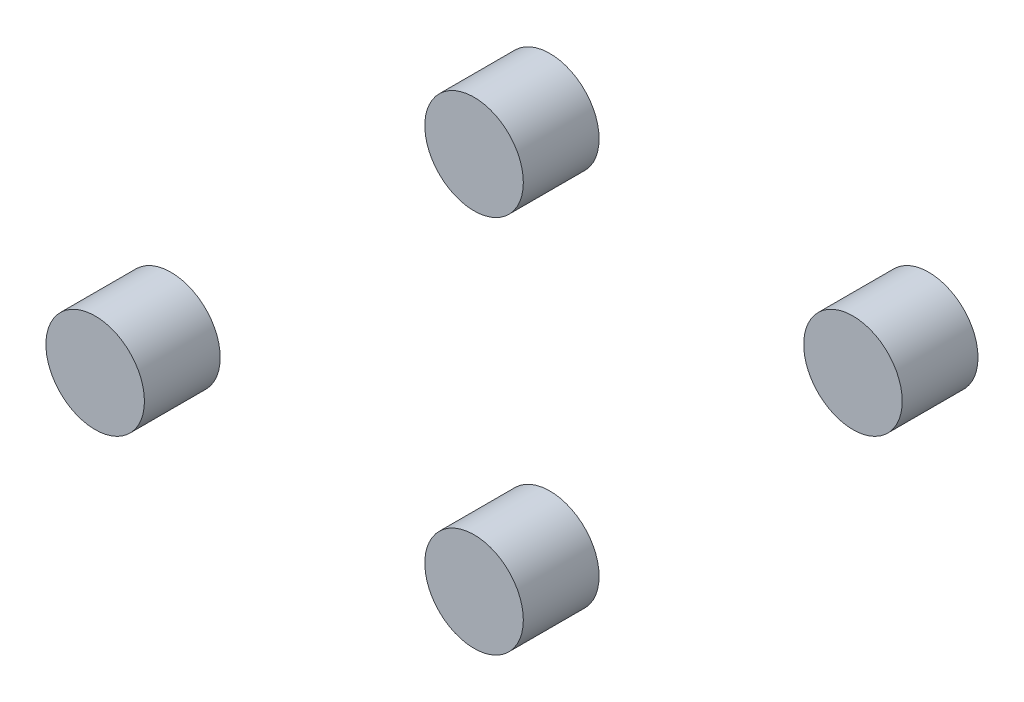
ISO-10303-21;
HEADER;
FILE_DESCRIPTION(('STEP AP214'),'2;1');
FILE_NAME('part.step','',(''),(''),'','','');
FILE_SCHEMA(('AUTOMOTIVE_DESIGN { 1 0 10303 214 1 1 1 1 }'));
ENDSEC;
DATA;
#1=APPLICATION_CONTEXT('core data for automotive mechanical design processes');
#2=APPLICATION_PROTOCOL_DEFINITION('international standard','automotive_design',2000,#1);
#3=PRODUCT_CONTEXT('',#1,'mechanical');
#4=PRODUCT('Part','Part','',(#3));
#5=PRODUCT_RELATED_PRODUCT_CATEGORY('part','',(#4));
#6=PRODUCT_DEFINITION_FORMATION('','',#4);
#7=PRODUCT_DEFINITION_CONTEXT('part definition',#1,'design');
#8=PRODUCT_DEFINITION('design','',#6,#7);
#9=PRODUCT_DEFINITION_SHAPE('','',#8);
#10=(LENGTH_UNIT() NAMED_UNIT(*) SI_UNIT(.MILLI.,.METRE.));
#11=(NAMED_UNIT(*) PLANE_ANGLE_UNIT() SI_UNIT($,.RADIAN.));
#12=(NAMED_UNIT(*) SI_UNIT($,.STERADIAN.) SOLID_ANGLE_UNIT());
#13=UNCERTAINTY_MEASURE_WITH_UNIT(LENGTH_MEASURE(1.E-05),#10,'distance_accuracy_value','');
#14=(GEOMETRIC_REPRESENTATION_CONTEXT(3) GLOBAL_UNCERTAINTY_ASSIGNED_CONTEXT((#13)) GLOBAL_UNIT_ASSIGNED_CONTEXT((#10,
#11,#12)) REPRESENTATION_CONTEXT('',''));
#15=CARTESIAN_POINT('',(0.,0.,0.));
#16=DIRECTION('',(0.,0.,1.));
#17=DIRECTION('',(1.,0.,0.));
#18=AXIS2_PLACEMENT_3D('',#15,#16,#17);
#19=CARTESIAN_POINT('',(381.,0.,-152.4));
#20=DIRECTION('',(0.,0.,-1.));
#21=DIRECTION('',(1.,0.,0.));
#22=AXIS2_PLACEMENT_3D('',#19,#20,#21);
#23=CYLINDRICAL_SURFACE('',#22,49.5300000000001);
#24=CARTESIAN_POINT('',(381.,0.,-152.4));
#25=DIRECTION('',(0.,0.,1.));
#26=DIRECTION('',(1.,0.,0.));
#27=AXIS2_PLACEMENT_3D('',#24,#25,#26);
#28=CIRCLE('',#27,49.5300000000001);
#29=CARTESIAN_POINT('',(430.53,0.,-152.4));
#30=VERTEX_POINT('',#29);
#31=EDGE_CURVE('E50',#30,#30,#28,.T.);
#32=CARTESIAN_POINT('',(381.,0.,-228.6));
#33=DIRECTION('',(0.,0.,1.));
#34=DIRECTION('',(1.,0.,0.));
#35=AXIS2_PLACEMENT_3D('',#32,#33,#34);
#36=CIRCLE('',#35,49.5300000000001);
#37=CARTESIAN_POINT('',(430.53,0.,-228.6));
#38=VERTEX_POINT('',#37);
#39=EDGE_CURVE('E11',#38,#38,#36,.T.);
#40=CARTESIAN_POINT('',(430.53,0.,-152.4));
#41=CARTESIAN_POINT('',(430.53,0.,-153.19375));
#42=CARTESIAN_POINT('',(430.53,0.,-153.9875));
#43=CARTESIAN_POINT('',(430.53,0.,-155.575));
#44=CARTESIAN_POINT('',(430.53,0.,-156.36875));
#45=CARTESIAN_POINT('',(430.53,0.,-157.95625));
#46=CARTESIAN_POINT('',(430.53,0.,-158.75));
#47=CARTESIAN_POINT('',(430.53,0.,-160.3375));
#48=CARTESIAN_POINT('',(430.53,0.,-161.13125));
#49=CARTESIAN_POINT('',(430.53,0.,-162.71875));
#50=CARTESIAN_POINT('',(430.53,0.,-163.5125));
#51=CARTESIAN_POINT('',(430.53,0.,-165.1));
#52=CARTESIAN_POINT('',(430.53,0.,-165.89375));
#53=CARTESIAN_POINT('',(430.53,0.,-167.48125));
#54=CARTESIAN_POINT('',(430.53,0.,-168.275));
#55=CARTESIAN_POINT('',(430.53,0.,-169.8625));
#56=CARTESIAN_POINT('',(430.53,0.,-170.65625));
#57=CARTESIAN_POINT('',(430.53,0.,-172.24375));
#58=CARTESIAN_POINT('',(430.53,0.,-173.0375));
#59=CARTESIAN_POINT('',(430.53,0.,-174.625));
#60=CARTESIAN_POINT('',(430.53,0.,-175.41875));
#61=CARTESIAN_POINT('',(430.53,0.,-177.00625));
#62=CARTESIAN_POINT('',(430.53,0.,-177.8));
#63=CARTESIAN_POINT('',(430.53,0.,-179.3875));
#64=CARTESIAN_POINT('',(430.53,0.,-180.18125));
#65=CARTESIAN_POINT('',(430.53,0.,-181.76875));
#66=CARTESIAN_POINT('',(430.53,0.,-182.5625));
#67=CARTESIAN_POINT('',(430.53,0.,-184.15));
#68=CARTESIAN_POINT('',(430.53,0.,-184.94375));
#69=CARTESIAN_POINT('',(430.53,0.,-186.53125));
#70=CARTESIAN_POINT('',(430.53,0.,-187.325));
#71=CARTESIAN_POINT('',(430.53,0.,-188.9125));
#72=CARTESIAN_POINT('',(430.53,0.,-189.70625));
#73=CARTESIAN_POINT('',(430.53,0.,-191.29375));
#74=CARTESIAN_POINT('',(430.53,0.,-192.0875));
#75=CARTESIAN_POINT('',(430.53,0.,-193.675));
#76=CARTESIAN_POINT('',(430.53,0.,-194.46875));
#77=CARTESIAN_POINT('',(430.53,0.,-196.05625));
#78=CARTESIAN_POINT('',(430.53,0.,-196.85));
#79=CARTESIAN_POINT('',(430.53,0.,-198.4375));
#80=CARTESIAN_POINT('',(430.53,0.,-199.23125));
#81=CARTESIAN_POINT('',(430.53,0.,-200.81875));
#82=CARTESIAN_POINT('',(430.53,0.,-201.6125));
#83=CARTESIAN_POINT('',(430.53,0.,-203.2));
#84=CARTESIAN_POINT('',(430.53,0.,-203.99375));
#85=CARTESIAN_POINT('',(430.53,0.,-205.58125));
#86=CARTESIAN_POINT('',(430.53,0.,-206.375));
#87=CARTESIAN_POINT('',(430.53,0.,-207.9625));
#88=CARTESIAN_POINT('',(430.53,0.,-208.75625));
#89=CARTESIAN_POINT('',(430.53,0.,-210.34375));
#90=CARTESIAN_POINT('',(430.53,0.,-211.1375));
#91=CARTESIAN_POINT('',(430.53,0.,-212.725));
#92=CARTESIAN_POINT('',(430.53,0.,-213.51875));
#93=CARTESIAN_POINT('',(430.53,0.,-215.10625));
#94=CARTESIAN_POINT('',(430.53,0.,-215.9));
#95=CARTESIAN_POINT('',(430.53,0.,-217.4875));
#96=CARTESIAN_POINT('',(430.53,0.,-218.28125));
#97=CARTESIAN_POINT('',(430.53,0.,-219.86875));
#98=CARTESIAN_POINT('',(430.53,0.,-220.6625));
#99=CARTESIAN_POINT('',(430.53,0.,-222.25));
#100=CARTESIAN_POINT('',(430.53,0.,-223.04375));
#101=CARTESIAN_POINT('',(430.53,0.,-224.63125));
#102=CARTESIAN_POINT('',(430.53,0.,-225.425));
#103=CARTESIAN_POINT('',(430.53,0.,-227.0125));
#104=CARTESIAN_POINT('',(430.53,0.,-227.80625));
#105=CARTESIAN_POINT('',(430.53,0.,-228.6));
#106=B_SPLINE_CURVE_WITH_KNOTS('',3,(#40,#41,#42,#43,#44,#45,#46,#47,#48,#49,#50,#51,#52,#53,
#54,#55,#56,#57,#58,#59,#60,#61,#62,#63,#64,#65,#66,#67,#68,#69,#70,#71,#72,#73,#74,#75,#76,#77,
#78,#79,#80,#81,#82,#83,#84,#85,#86,#87,#88,#89,#90,#91,#92,#93,#94,#95,#96,#97,#98,#99,#100,
#101,#102,#103,#104,#105),.UNSPECIFIED.,.F.,.F.,(4,2,2,2,2,2,2,2,2,2,2,2,2,2,2,2,2,2,2,2,2,2,2,
2,2,2,2,2,2,2,2,2,4),(0.,2.38124999999997,4.76249999999998,7.14374999999998,9.52499999999998,
11.90625,14.2875,16.66875,19.05,21.43125,23.8125,26.19375,28.575,30.95625,33.3375,35.71875,38.1,
40.48125,42.8625,45.24375,47.625,50.00625,52.3875,54.76875,57.15,59.53125,61.9125,64.29375,
66.675,69.05625,71.4375,73.81875,76.2),.UNSPECIFIED.);
#107=EDGE_CURVE('BSEAM46',#30,#38,#106,.T.);
#108=ORIENTED_EDGE('',*,*,#31,.F.);
#109=ORIENTED_EDGE('',*,*,#39,.T.);
#110=ORIENTED_EDGE('',*,*,#107,.T.);
#111=ORIENTED_EDGE('',*,*,#107,.F.);
#112=EDGE_LOOP('',(#108,#110,#109,#111));
#113=FACE_BOUND('',#112,.T.);
#114=ADVANCED_FACE('F46',(#113),#23,.T.);
#115=CARTESIAN_POINT('',(381.,0.,-152.4));
#116=DIRECTION('',(0.,0.,-1.));
#117=DIRECTION('',(1.,0.,0.));
#118=AXIS2_PLACEMENT_3D('',#115,#116,#117);
#119=PLANE('',#118);
#120=ORIENTED_EDGE('',*,*,#31,.T.);
#121=EDGE_LOOP('',(#120));
#122=FACE_BOUND('',#121,.T.);
#123=ADVANCED_FACE('F48',(#122),#119,.F.);
#124=CARTESIAN_POINT('',(381.,0.,-228.6));
#125=DIRECTION('',(0.,0.,-1.));
#126=DIRECTION('',(1.,0.,0.));
#127=AXIS2_PLACEMENT_3D('',#124,#125,#126);
#128=PLANE('',#127);
#129=ORIENTED_EDGE('',*,*,#39,.F.);
#130=EDGE_LOOP('',(#129));
#131=FACE_BOUND('',#130,.T.);
#132=ADVANCED_FACE('F65',(#131),#128,.T.);
#133=CLOSED_SHELL('',(#114,#123,#132));
#134=MANIFOLD_SOLID_BREP('B2',#133);
#135=CARTESIAN_POINT('',(0.,0.,-152.4));
#136=DIRECTION('',(0.,0.,-1.));
#137=DIRECTION('',(1.,0.,0.));
#138=AXIS2_PLACEMENT_3D('',#135,#136,#137);
#139=CYLINDRICAL_SURFACE('',#138,49.53);
#140=CARTESIAN_POINT('',(0.,0.,-152.4));
#141=DIRECTION('',(0.,0.,1.));
#142=DIRECTION('',(1.,0.,0.));
#143=AXIS2_PLACEMENT_3D('',#140,#141,#142);
#144=CIRCLE('',#143,49.53);
#145=CARTESIAN_POINT('',(49.53,0.,-152.4));
#146=VERTEX_POINT('',#145);
#147=EDGE_CURVE('E45',#146,#146,#144,.T.);
#148=CARTESIAN_POINT('',(0.,0.,-228.6));
#149=DIRECTION('',(0.,0.,1.));
#150=DIRECTION('',(1.,0.,0.));
#151=AXIS2_PLACEMENT_3D('',#148,#149,#150);
#152=CIRCLE('',#151,49.53);
#153=CARTESIAN_POINT('',(49.53,0.,-228.6));
#154=VERTEX_POINT('',#153);
#155=EDGE_CURVE('E98',#154,#154,#152,.T.);
#156=CARTESIAN_POINT('',(49.53,0.,-152.4));
#157=CARTESIAN_POINT('',(49.53,0.,-153.19375));
#158=CARTESIAN_POINT('',(49.53,0.,-153.9875));
#159=CARTESIAN_POINT('',(49.53,0.,-155.575));
#160=CARTESIAN_POINT('',(49.53,0.,-156.36875));
#161=CARTESIAN_POINT('',(49.53,0.,-157.95625));
#162=CARTESIAN_POINT('',(49.53,0.,-158.75));
#163=CARTESIAN_POINT('',(49.53,0.,-160.3375));
#164=CARTESIAN_POINT('',(49.53,0.,-161.13125));
#165=CARTESIAN_POINT('',(49.53,0.,-162.71875));
#166=CARTESIAN_POINT('',(49.53,0.,-163.5125));
#167=CARTESIAN_POINT('',(49.53,0.,-165.1));
#168=CARTESIAN_POINT('',(49.53,0.,-165.89375));
#169=CARTESIAN_POINT('',(49.53,0.,-167.48125));
#170=CARTESIAN_POINT('',(49.53,0.,-168.275));
#171=CARTESIAN_POINT('',(49.53,0.,-169.8625));
#172=CARTESIAN_POINT('',(49.53,0.,-170.65625));
#173=CARTESIAN_POINT('',(49.53,0.,-172.24375));
#174=CARTESIAN_POINT('',(49.53,0.,-173.0375));
#175=CARTESIAN_POINT('',(49.53,0.,-174.625));
#176=CARTESIAN_POINT('',(49.53,0.,-175.41875));
#177=CARTESIAN_POINT('',(49.53,0.,-177.00625));
#178=CARTESIAN_POINT('',(49.53,0.,-177.8));
#179=CARTESIAN_POINT('',(49.53,0.,-179.3875));
#180=CARTESIAN_POINT('',(49.53,0.,-180.18125));
#181=CARTESIAN_POINT('',(49.53,0.,-181.76875));
#182=CARTESIAN_POINT('',(49.53,0.,-182.5625));
#183=CARTESIAN_POINT('',(49.53,0.,-184.15));
#184=CARTESIAN_POINT('',(49.53,0.,-184.94375));
#185=CARTESIAN_POINT('',(49.53,0.,-186.53125));
#186=CARTESIAN_POINT('',(49.53,0.,-187.325));
#187=CARTESIAN_POINT('',(49.53,0.,-188.9125));
#188=CARTESIAN_POINT('',(49.53,0.,-189.70625));
#189=CARTESIAN_POINT('',(49.53,0.,-191.29375));
#190=CARTESIAN_POINT('',(49.53,0.,-192.0875));
#191=CARTESIAN_POINT('',(49.53,0.,-193.675));
#192=CARTESIAN_POINT('',(49.53,0.,-194.46875));
#193=CARTESIAN_POINT('',(49.53,0.,-196.05625));
#194=CARTESIAN_POINT('',(49.53,0.,-196.85));
#195=CARTESIAN_POINT('',(49.53,0.,-198.4375));
#196=CARTESIAN_POINT('',(49.53,0.,-199.23125));
#197=CARTESIAN_POINT('',(49.53,0.,-200.81875));
#198=CARTESIAN_POINT('',(49.53,0.,-201.6125));
#199=CARTESIAN_POINT('',(49.53,0.,-203.2));
#200=CARTESIAN_POINT('',(49.53,0.,-203.99375));
#201=CARTESIAN_POINT('',(49.53,0.,-205.58125));
#202=CARTESIAN_POINT('',(49.53,0.,-206.375));
#203=CARTESIAN_POINT('',(49.53,0.,-207.9625));
#204=CARTESIAN_POINT('',(49.53,0.,-208.75625));
#205=CARTESIAN_POINT('',(49.53,0.,-210.34375));
#206=CARTESIAN_POINT('',(49.53,0.,-211.1375));
#207=CARTESIAN_POINT('',(49.53,0.,-212.725));
#208=CARTESIAN_POINT('',(49.53,0.,-213.51875));
#209=CARTESIAN_POINT('',(49.53,0.,-215.10625));
#210=CARTESIAN_POINT('',(49.53,0.,-215.9));
#211=CARTESIAN_POINT('',(49.53,0.,-217.4875));
#212=CARTESIAN_POINT('',(49.53,0.,-218.28125));
#213=CARTESIAN_POINT('',(49.53,0.,-219.86875));
#214=CARTESIAN_POINT('',(49.53,0.,-220.6625));
#215=CARTESIAN_POINT('',(49.53,0.,-222.25));
#216=CARTESIAN_POINT('',(49.53,0.,-223.04375));
#217=CARTESIAN_POINT('',(49.53,0.,-224.63125));
#218=CARTESIAN_POINT('',(49.53,0.,-225.425));
#219=CARTESIAN_POINT('',(49.53,0.,-227.0125));
#220=CARTESIAN_POINT('',(49.53,0.,-227.80625));
#221=CARTESIAN_POINT('',(49.53,0.,-228.6));
#222=B_SPLINE_CURVE_WITH_KNOTS('',3,(#156,#157,#158,#159,#160,#161,#162,#163,#164,#165,#166,
#167,#168,#169,#170,#171,#172,#173,#174,#175,#176,#177,#178,#179,#180,#181,#182,#183,#184,#185,
#186,#187,#188,#189,#190,#191,#192,#193,#194,#195,#196,#197,#198,#199,#200,#201,#202,#203,#204,
#205,#206,#207,#208,#209,#210,#211,#212,#213,#214,#215,#216,#217,#218,#219,#220,#221),
.UNSPECIFIED.,.F.,.F.,(4,2,2,2,2,2,2,2,2,2,2,2,2,2,2,2,2,2,2,2,2,2,2,2,2,2,2,2,2,2,2,2,4),(0.,
2.38124999999997,4.76249999999998,7.14374999999998,9.52499999999998,11.90625,14.2875,16.66875,
19.05,21.43125,23.8125,26.19375,28.575,30.95625,33.3375,35.71875,38.1,40.48125,42.8625,45.24375,
47.625,50.00625,52.3875,54.76875,57.15,59.53125,61.9125,64.29375,66.675,69.05625,71.4375,
73.81875,76.2),.UNSPECIFIED.);
#223=EDGE_CURVE('BSEAM95',#146,#154,#222,.T.);
#224=ORIENTED_EDGE('',*,*,#147,.F.);
#225=ORIENTED_EDGE('',*,*,#155,.T.);
#226=ORIENTED_EDGE('',*,*,#223,.T.);
#227=ORIENTED_EDGE('',*,*,#223,.F.);
#228=EDGE_LOOP('',(#224,#226,#225,#227));
#229=FACE_BOUND('',#228,.T.);
#230=ADVANCED_FACE('F95',(#229),#139,.T.);
#231=CARTESIAN_POINT('',(0.,0.,-152.4));
#232=DIRECTION('',(0.,0.,-1.));
#233=DIRECTION('',(1.,0.,0.));
#234=AXIS2_PLACEMENT_3D('',#231,#232,#233);
#235=PLANE('',#234);
#236=ORIENTED_EDGE('',*,*,#147,.T.);
#237=EDGE_LOOP('',(#236));
#238=FACE_BOUND('',#237,.T.);
#239=ADVANCED_FACE('F110',(#238),#235,.F.);
#240=CARTESIAN_POINT('',(0.,0.,-228.6));
#241=DIRECTION('',(0.,0.,-1.));
#242=DIRECTION('',(1.,0.,0.));
#243=AXIS2_PLACEMENT_3D('',#240,#241,#242);
#244=PLANE('',#243);
#245=ORIENTED_EDGE('',*,*,#155,.F.);
#246=EDGE_LOOP('',(#245));
#247=FACE_BOUND('',#246,.T.);
#248=ADVANCED_FACE('F108',(#247),#244,.T.);
#249=CLOSED_SHELL('',(#230,#239,#248));
#250=MANIFOLD_SOLID_BREP('B6',#249);
#251=CARTESIAN_POINT('',(381.,0.,152.4));
#252=DIRECTION('',(0.,0.,1.));
#253=DIRECTION('',(1.,0.,0.));
#254=AXIS2_PLACEMENT_3D('',#251,#252,#253);
#255=CYLINDRICAL_SURFACE('',#254,49.5300000000001);
#256=CARTESIAN_POINT('',(381.,0.,152.4));
#257=DIRECTION('',(0.,0.,1.));
#258=DIRECTION('',(1.,0.,0.));
#259=AXIS2_PLACEMENT_3D('',#256,#257,#258);
#260=CIRCLE('',#259,49.5300000000001);
#261=CARTESIAN_POINT('',(430.53,0.,152.4));
#262=VERTEX_POINT('',#261);
#263=EDGE_CURVE('E147',#262,#262,#260,.T.);
#264=CARTESIAN_POINT('',(381.,0.,228.6));
#265=DIRECTION('',(0.,0.,1.));
#266=DIRECTION('',(1.,0.,0.));
#267=AXIS2_PLACEMENT_3D('',#264,#265,#266);
#268=CIRCLE('',#267,49.5300000000001);
#269=CARTESIAN_POINT('',(430.53,0.,228.6));
#270=VERTEX_POINT('',#269);
#271=EDGE_CURVE('E94',#270,#270,#268,.T.);
#272=CARTESIAN_POINT('',(430.53,0.,152.4));
#273=CARTESIAN_POINT('',(430.53,0.,153.19375));
#274=CARTESIAN_POINT('',(430.53,0.,153.9875));
#275=CARTESIAN_POINT('',(430.53,0.,155.575));
#276=CARTESIAN_POINT('',(430.53,0.,156.36875));
#277=CARTESIAN_POINT('',(430.53,0.,157.95625));
#278=CARTESIAN_POINT('',(430.53,0.,158.75));
#279=CARTESIAN_POINT('',(430.53,0.,160.3375));
#280=CARTESIAN_POINT('',(430.53,0.,161.13125));
#281=CARTESIAN_POINT('',(430.53,0.,162.71875));
#282=CARTESIAN_POINT('',(430.53,0.,163.5125));
#283=CARTESIAN_POINT('',(430.53,0.,165.1));
#284=CARTESIAN_POINT('',(430.53,0.,165.89375));
#285=CARTESIAN_POINT('',(430.53,0.,167.48125));
#286=CARTESIAN_POINT('',(430.53,0.,168.275));
#287=CARTESIAN_POINT('',(430.53,0.,169.8625));
#288=CARTESIAN_POINT('',(430.53,0.,170.65625));
#289=CARTESIAN_POINT('',(430.53,0.,172.24375));
#290=CARTESIAN_POINT('',(430.53,0.,173.0375));
#291=CARTESIAN_POINT('',(430.53,0.,174.625));
#292=CARTESIAN_POINT('',(430.53,0.,175.41875));
#293=CARTESIAN_POINT('',(430.53,0.,177.00625));
#294=CARTESIAN_POINT('',(430.53,0.,177.8));
#295=CARTESIAN_POINT('',(430.53,0.,179.3875));
#296=CARTESIAN_POINT('',(430.53,0.,180.18125));
#297=CARTESIAN_POINT('',(430.53,0.,181.76875));
#298=CARTESIAN_POINT('',(430.53,0.,182.5625));
#299=CARTESIAN_POINT('',(430.53,0.,184.15));
#300=CARTESIAN_POINT('',(430.53,0.,184.94375));
#301=CARTESIAN_POINT('',(430.53,0.,186.53125));
#302=CARTESIAN_POINT('',(430.53,0.,187.325));
#303=CARTESIAN_POINT('',(430.53,0.,188.9125));
#304=CARTESIAN_POINT('',(430.53,0.,189.70625));
#305=CARTESIAN_POINT('',(430.53,0.,191.29375));
#306=CARTESIAN_POINT('',(430.53,0.,192.0875));
#307=CARTESIAN_POINT('',(430.53,0.,193.675));
#308=CARTESIAN_POINT('',(430.53,0.,194.46875));
#309=CARTESIAN_POINT('',(430.53,0.,196.05625));
#310=CARTESIAN_POINT('',(430.53,0.,196.85));
#311=CARTESIAN_POINT('',(430.53,0.,198.4375));
#312=CARTESIAN_POINT('',(430.53,0.,199.23125));
#313=CARTESIAN_POINT('',(430.53,0.,200.81875));
#314=CARTESIAN_POINT('',(430.53,0.,201.6125));
#315=CARTESIAN_POINT('',(430.53,0.,203.2));
#316=CARTESIAN_POINT('',(430.53,0.,203.99375));
#317=CARTESIAN_POINT('',(430.53,0.,205.58125));
#318=CARTESIAN_POINT('',(430.53,0.,206.375));
#319=CARTESIAN_POINT('',(430.53,0.,207.9625));
#320=CARTESIAN_POINT('',(430.53,0.,208.75625));
#321=CARTESIAN_POINT('',(430.53,0.,210.34375));
#322=CARTESIAN_POINT('',(430.53,0.,211.1375));
#323=CARTESIAN_POINT('',(430.53,0.,212.725));
#324=CARTESIAN_POINT('',(430.53,0.,213.51875));
#325=CARTESIAN_POINT('',(430.53,0.,215.10625));
#326=CARTESIAN_POINT('',(430.53,0.,215.9));
#327=CARTESIAN_POINT('',(430.53,0.,217.4875));
#328=CARTESIAN_POINT('',(430.53,0.,218.28125));
#329=CARTESIAN_POINT('',(430.53,0.,219.86875));
#330=CARTESIAN_POINT('',(430.53,0.,220.6625));
#331=CARTESIAN_POINT('',(430.53,0.,222.25));
#332=CARTESIAN_POINT('',(430.53,0.,223.04375));
#333=CARTESIAN_POINT('',(430.53,0.,224.63125));
#334=CARTESIAN_POINT('',(430.53,0.,225.425));
#335=CARTESIAN_POINT('',(430.53,0.,227.0125));
#336=CARTESIAN_POINT('',(430.53,0.,227.80625));
#337=CARTESIAN_POINT('',(430.53,0.,228.6));
#338=B_SPLINE_CURVE_WITH_KNOTS('',3,(#272,#273,#274,#275,#276,#277,#278,#279,#280,#281,#282,
#283,#284,#285,#286,#287,#288,#289,#290,#291,#292,#293,#294,#295,#296,#297,#298,#299,#300,#301,
#302,#303,#304,#305,#306,#307,#308,#309,#310,#311,#312,#313,#314,#315,#316,#317,#318,#319,#320,
#321,#322,#323,#324,#325,#326,#327,#328,#329,#330,#331,#332,#333,#334,#335,#336,#337),
.UNSPECIFIED.,.F.,.F.,(4,2,2,2,2,2,2,2,2,2,2,2,2,2,2,2,2,2,2,2,2,2,2,2,2,2,2,2,2,2,2,2,4),(0.,
2.38125,4.7625,7.14375,9.52500000000001,11.90625,14.2875,16.66875,19.05,21.43125,23.8125,
26.19375,28.575,30.95625,33.3375,35.71875,38.1,40.48125,42.8625,45.24375,47.625,50.00625,
52.3875,54.76875,57.15,59.53125,61.9125,64.29375,66.675,69.05625,71.4375,73.81875,76.2),.UNSPECIFIED.);
#339=EDGE_CURVE('BSEAM143',#262,#270,#338,.T.);
#340=ORIENTED_EDGE('',*,*,#263,.T.);
#341=ORIENTED_EDGE('',*,*,#271,.F.);
#342=ORIENTED_EDGE('',*,*,#339,.T.);
#343=ORIENTED_EDGE('',*,*,#339,.F.);
#344=EDGE_LOOP('',(#340,#342,#341,#343));
#345=FACE_BOUND('',#344,.T.);
#346=ADVANCED_FACE('F143',(#345),#255,.T.);
#347=CARTESIAN_POINT('',(381.,0.,152.4));
#348=DIRECTION('',(0.,0.,1.));
#349=DIRECTION('',(1.,0.,0.));
#350=AXIS2_PLACEMENT_3D('',#347,#348,#349);
#351=PLANE('',#350);
#352=ORIENTED_EDGE('',*,*,#263,.F.);
#353=EDGE_LOOP('',(#352));
#354=FACE_BOUND('',#353,.T.);
#355=ADVANCED_FACE('F145',(#354),#351,.F.);
#356=CARTESIAN_POINT('',(381.,0.,228.6));
#357=DIRECTION('',(0.,0.,1.));
#358=DIRECTION('',(1.,0.,0.));
#359=AXIS2_PLACEMENT_3D('',#356,#357,#358);
#360=PLANE('',#359);
#361=ORIENTED_EDGE('',*,*,#271,.T.);
#362=EDGE_LOOP('',(#361));
#363=FACE_BOUND('',#362,.T.);
#364=ADVANCED_FACE('F159',(#363),#360,.T.);
#365=CLOSED_SHELL('',(#346,#355,#364));
#366=MANIFOLD_SOLID_BREP('B40',#365);
#367=CARTESIAN_POINT('',(0.,0.,152.4));
#368=DIRECTION('',(0.,0.,1.));
#369=DIRECTION('',(1.,0.,0.));
#370=AXIS2_PLACEMENT_3D('',#367,#368,#369);
#371=CYLINDRICAL_SURFACE('',#370,49.53);
#372=CARTESIAN_POINT('',(0.,0.,152.4));
#373=DIRECTION('',(0.,0.,1.));
#374=DIRECTION('',(1.,0.,0.));
#375=AXIS2_PLACEMENT_3D('',#372,#373,#374);
#376=CIRCLE('',#375,49.53);
#377=CARTESIAN_POINT('',(49.53,0.,152.4));
#378=VERTEX_POINT('',#377);
#379=EDGE_CURVE('E142',#378,#378,#376,.T.);
#380=CARTESIAN_POINT('',(0.,0.,228.6));
#381=DIRECTION('',(0.,0.,1.));
#382=DIRECTION('',(1.,0.,0.));
#383=AXIS2_PLACEMENT_3D('',#380,#381,#382);
#384=CIRCLE('',#383,49.53);
#385=CARTESIAN_POINT('',(49.53,0.,228.6));
#386=VERTEX_POINT('',#385);
#387=EDGE_CURVE('E187',#386,#386,#384,.T.);
#388=CARTESIAN_POINT('',(49.53,0.,152.4));
#389=CARTESIAN_POINT('',(49.53,0.,153.19375));
#390=CARTESIAN_POINT('',(49.53,0.,153.9875));
#391=CARTESIAN_POINT('',(49.53,0.,155.575));
#392=CARTESIAN_POINT('',(49.53,0.,156.36875));
#393=CARTESIAN_POINT('',(49.53,0.,157.95625));
#394=CARTESIAN_POINT('',(49.53,0.,158.75));
#395=CARTESIAN_POINT('',(49.53,0.,160.3375));
#396=CARTESIAN_POINT('',(49.53,0.,161.13125));
#397=CARTESIAN_POINT('',(49.53,0.,162.71875));
#398=CARTESIAN_POINT('',(49.53,0.,163.5125));
#399=CARTESIAN_POINT('',(49.53,0.,165.1));
#400=CARTESIAN_POINT('',(49.53,0.,165.89375));
#401=CARTESIAN_POINT('',(49.53,0.,167.48125));
#402=CARTESIAN_POINT('',(49.53,0.,168.275));
#403=CARTESIAN_POINT('',(49.53,0.,169.8625));
#404=CARTESIAN_POINT('',(49.53,0.,170.65625));
#405=CARTESIAN_POINT('',(49.53,0.,172.24375));
#406=CARTESIAN_POINT('',(49.53,0.,173.0375));
#407=CARTESIAN_POINT('',(49.53,0.,174.625));
#408=CARTESIAN_POINT('',(49.53,0.,175.41875));
#409=CARTESIAN_POINT('',(49.53,0.,177.00625));
#410=CARTESIAN_POINT('',(49.53,0.,177.8));
#411=CARTESIAN_POINT('',(49.53,0.,179.3875));
#412=CARTESIAN_POINT('',(49.53,0.,180.18125));
#413=CARTESIAN_POINT('',(49.53,0.,181.76875));
#414=CARTESIAN_POINT('',(49.53,0.,182.5625));
#415=CARTESIAN_POINT('',(49.53,0.,184.15));
#416=CARTESIAN_POINT('',(49.53,0.,184.94375));
#417=CARTESIAN_POINT('',(49.53,0.,186.53125));
#418=CARTESIAN_POINT('',(49.53,0.,187.325));
#419=CARTESIAN_POINT('',(49.53,0.,188.9125));
#420=CARTESIAN_POINT('',(49.53,0.,189.70625));
#421=CARTESIAN_POINT('',(49.53,0.,191.29375));
#422=CARTESIAN_POINT('',(49.53,0.,192.0875));
#423=CARTESIAN_POINT('',(49.53,0.,193.675));
#424=CARTESIAN_POINT('',(49.53,0.,194.46875));
#425=CARTESIAN_POINT('',(49.53,0.,196.05625));
#426=CARTESIAN_POINT('',(49.53,0.,196.85));
#427=CARTESIAN_POINT('',(49.53,0.,198.4375));
#428=CARTESIAN_POINT('',(49.53,0.,199.23125));
#429=CARTESIAN_POINT('',(49.53,0.,200.81875));
#430=CARTESIAN_POINT('',(49.53,0.,201.6125));
#431=CARTESIAN_POINT('',(49.53,0.,203.2));
#432=CARTESIAN_POINT('',(49.53,0.,203.99375));
#433=CARTESIAN_POINT('',(49.53,0.,205.58125));
#434=CARTESIAN_POINT('',(49.53,0.,206.375));
#435=CARTESIAN_POINT('',(49.53,0.,207.9625));
#436=CARTESIAN_POINT('',(49.53,0.,208.75625));
#437=CARTESIAN_POINT('',(49.53,0.,210.34375));
#438=CARTESIAN_POINT('',(49.53,0.,211.1375));
#439=CARTESIAN_POINT('',(49.53,0.,212.725));
#440=CARTESIAN_POINT('',(49.53,0.,213.51875));
#441=CARTESIAN_POINT('',(49.53,0.,215.10625));
#442=CARTESIAN_POINT('',(49.53,0.,215.9));
#443=CARTESIAN_POINT('',(49.53,0.,217.4875));
#444=CARTESIAN_POINT('',(49.53,0.,218.28125));
#445=CARTESIAN_POINT('',(49.53,0.,219.86875));
#446=CARTESIAN_POINT('',(49.53,0.,220.6625));
#447=CARTESIAN_POINT('',(49.53,0.,222.25));
#448=CARTESIAN_POINT('',(49.53,0.,223.04375));
#449=CARTESIAN_POINT('',(49.53,0.,224.63125));
#450=CARTESIAN_POINT('',(49.53,0.,225.425));
#451=CARTESIAN_POINT('',(49.53,0.,227.0125));
#452=CARTESIAN_POINT('',(49.53,0.,227.80625));
#453=CARTESIAN_POINT('',(49.53,0.,228.6));
#454=B_SPLINE_CURVE_WITH_KNOTS('',3,(#388,#389,#390,#391,#392,#393,#394,#395,#396,#397,#398,
#399,#400,#401,#402,#403,#404,#405,#406,#407,#408,#409,#410,#411,#412,#413,#414,#415,#416,#417,
#418,#419,#420,#421,#422,#423,#424,#425,#426,#427,#428,#429,#430,#431,#432,#433,#434,#435,#436,
#437,#438,#439,#440,#441,#442,#443,#444,#445,#446,#447,#448,#449,#450,#451,#452,#453),
.UNSPECIFIED.,.F.,.F.,(4,2,2,2,2,2,2,2,2,2,2,2,2,2,2,2,2,2,2,2,2,2,2,2,2,2,2,2,2,2,2,2,4),(0.,
2.38125,4.7625,7.14375,9.52500000000001,11.90625,14.2875,16.66875,19.05,21.43125,23.8125,
26.19375,28.575,30.95625,33.3375,35.71875,38.1,40.48125,42.8625,45.24375,47.625,50.00625,
52.3875,54.76875,57.15,59.53125,61.9125,64.29375,66.675,69.05625,71.4375,73.81875,76.2),.UNSPECIFIED.);
#455=EDGE_CURVE('BSEAM184',#378,#386,#454,.T.);
#456=ORIENTED_EDGE('',*,*,#379,.T.);
#457=ORIENTED_EDGE('',*,*,#387,.F.);
#458=ORIENTED_EDGE('',*,*,#455,.T.);
#459=ORIENTED_EDGE('',*,*,#455,.F.);
#460=EDGE_LOOP('',(#456,#458,#457,#459));
#461=FACE_BOUND('',#460,.T.);
#462=ADVANCED_FACE('F184',(#461),#371,.T.);
#463=CARTESIAN_POINT('',(0.,0.,152.4));
#464=DIRECTION('',(0.,0.,1.));
#465=DIRECTION('',(1.,0.,0.));
#466=AXIS2_PLACEMENT_3D('',#463,#464,#465);
#467=PLANE('',#466);
#468=ORIENTED_EDGE('',*,*,#379,.F.);
#469=EDGE_LOOP('',(#468));
#470=FACE_BOUND('',#469,.T.);
#471=ADVANCED_FACE('F199',(#470),#467,.F.);
#472=CARTESIAN_POINT('',(0.,0.,228.6));
#473=DIRECTION('',(0.,0.,1.));
#474=DIRECTION('',(1.,0.,0.));
#475=AXIS2_PLACEMENT_3D('',#472,#473,#474);
#476=PLANE('',#475);
#477=ORIENTED_EDGE('',*,*,#387,.T.);
#478=EDGE_LOOP('',(#477));
#479=FACE_BOUND('',#478,.T.);
#480=ADVANCED_FACE('F196',(#479),#476,.T.);
#481=CLOSED_SHELL('',(#462,#471,#480));
#482=MANIFOLD_SOLID_BREP('B89',#481);
#483=ADVANCED_BREP_SHAPE_REPRESENTATION('',(#18,#134,#250,#366,#482),#14);
#484=SHAPE_DEFINITION_REPRESENTATION(#9,#483);
ENDSEC;
END-ISO-10303-21;
